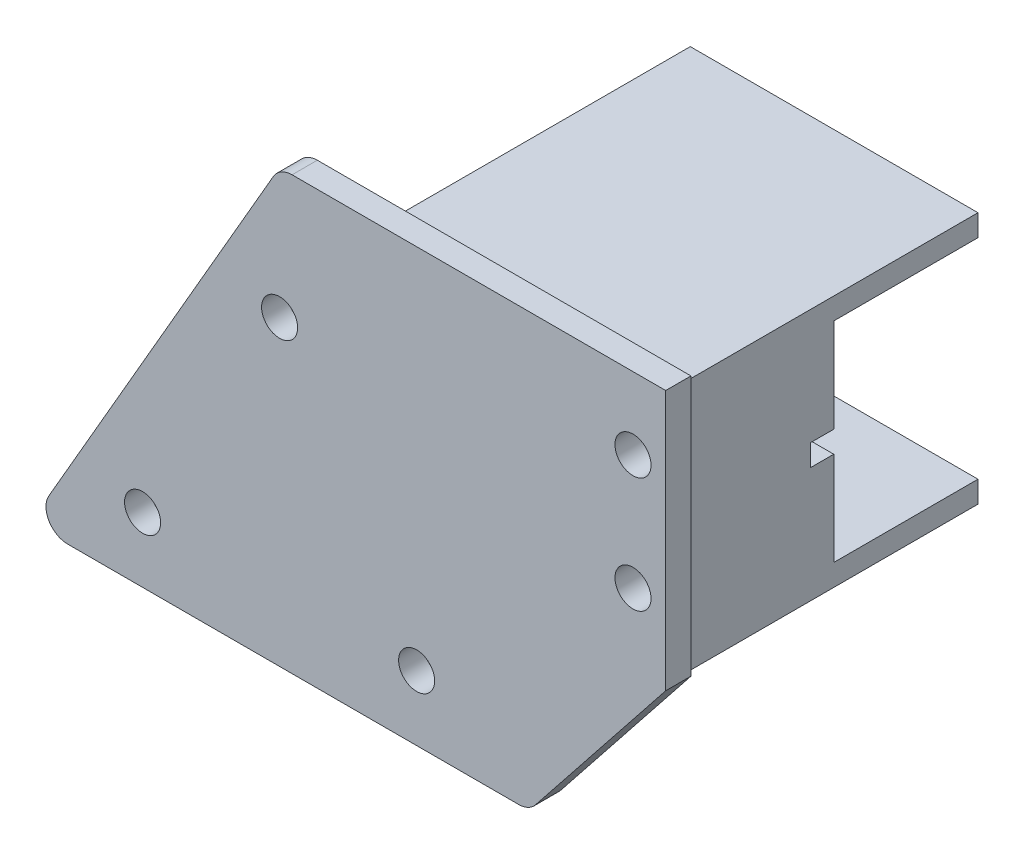
ISO-10303-21;
HEADER;
FILE_DESCRIPTION(('STEP AP214'),'2;1');
FILE_NAME('part.step','',(''),(''),'','','');
FILE_SCHEMA(('AUTOMOTIVE_DESIGN { 1 0 10303 214 1 1 1 1 }'));
ENDSEC;
DATA;
#1=APPLICATION_CONTEXT('core data for automotive mechanical design processes');
#2=APPLICATION_PROTOCOL_DEFINITION('international standard','automotive_design',2000,#1);
#3=PRODUCT_CONTEXT('',#1,'mechanical');
#4=PRODUCT('Part','Part','',(#3));
#5=PRODUCT_RELATED_PRODUCT_CATEGORY('part','',(#4));
#6=PRODUCT_DEFINITION_FORMATION('','',#4);
#7=PRODUCT_DEFINITION_CONTEXT('part definition',#1,'design');
#8=PRODUCT_DEFINITION('design','',#6,#7);
#9=PRODUCT_DEFINITION_SHAPE('','',#8);
#10=(LENGTH_UNIT() NAMED_UNIT(*) SI_UNIT(.MILLI.,.METRE.));
#11=(NAMED_UNIT(*) PLANE_ANGLE_UNIT() SI_UNIT($,.RADIAN.));
#12=(NAMED_UNIT(*) SI_UNIT($,.STERADIAN.) SOLID_ANGLE_UNIT());
#13=UNCERTAINTY_MEASURE_WITH_UNIT(LENGTH_MEASURE(1.E-05),#10,'distance_accuracy_value','');
#14=(GEOMETRIC_REPRESENTATION_CONTEXT(3) GLOBAL_UNCERTAINTY_ASSIGNED_CONTEXT((#13)) GLOBAL_UNIT_ASSIGNED_CONTEXT((#10,
#11,#12)) REPRESENTATION_CONTEXT('',''));
#15=CARTESIAN_POINT('',(0.,0.,0.));
#16=DIRECTION('',(0.,0.,1.));
#17=DIRECTION('',(1.,0.,0.));
#18=AXIS2_PLACEMENT_3D('',#15,#16,#17);
#19=CARTESIAN_POINT('',(0.,0.,-20.));
#20=DIRECTION('',(0.,0.,-1.));
#21=DIRECTION('',(-1.,0.,0.));
#22=AXIS2_PLACEMENT_3D('',#19,#20,#21);
#23=PLANE('',#22);
#24=CARTESIAN_POINT('',(50.8315186122816,40.9089653438087,-20.));
#25=DIRECTION('',(0.,0.,-1.));
#26=DIRECTION('',(-1.,0.,0.));
#27=AXIS2_PLACEMENT_3D('',#24,#25,#26);
#28=CIRCLE('',#27,2.5);
#29=CARTESIAN_POINT('',(48.3315186122816,40.9089653438087,-20.));
#30=VERTEX_POINT('',#29);
#31=EDGE_CURVE('E330',#30,#30,#28,.T.);
#32=ORIENTED_EDGE('',*,*,#31,.F.);
#33=EDGE_LOOP('',(#32));
#34=FACE_BOUND('',#33,.T.);
#35=DIRECTION('',(0.,-1.,0.));
#36=VECTOR('',#35,1.);
#37=CARTESIAN_POINT('',(46.8315186122816,0.,-20.));
#38=LINE('',#37,#36);
#39=CARTESIAN_POINT('',(46.8315186122816,47.4089653438087,-20.));
#40=VERTEX_POINT('',#39);
#41=CARTESIAN_POINT('',(46.8315186122816,34.4089653438087,-20.));
#42=VERTEX_POINT('',#41);
#43=EDGE_CURVE('E354',#40,#42,#38,.T.);
#44=ORIENTED_EDGE('',*,*,#43,.F.);
#45=DIRECTION('',(1.,0.,0.));
#46=VECTOR('',#45,1.);
#47=CARTESIAN_POINT('',(0.,47.4089653438087,-20.));
#48=LINE('',#47,#46);
#49=CARTESIAN_POINT('',(55.1718698455063,47.4089653438087,-20.));
#50=VERTEX_POINT('',#49);
#51=EDGE_CURVE('E306',#40,#50,#48,.T.);
#52=ORIENTED_EDGE('',*,*,#51,.T.);
#53=DIRECTION('',(0.,1.,0.));
#54=VECTOR('',#53,1.);
#55=CARTESIAN_POINT('',(55.1718698455063,47.4089653438087,-20.));
#56=LINE('',#55,#54);
#57=CARTESIAN_POINT('',(55.1718698455063,34.4089653438087,-20.));
#58=VERTEX_POINT('',#57);
#59=EDGE_CURVE('E335',#58,#50,#56,.T.);
#60=ORIENTED_EDGE('',*,*,#59,.F.);
#61=DIRECTION('',(1.,0.,0.));
#62=VECTOR('',#61,1.);
#63=CARTESIAN_POINT('',(0.,34.4089653438087,-20.));
#64=LINE('',#63,#62);
#65=EDGE_CURVE('E357',#42,#58,#64,.T.);
#66=ORIENTED_EDGE('',*,*,#65,.F.);
#67=EDGE_LOOP('',(#44,#52,#60,#66));
#68=FACE_BOUND('',#67,.T.);
#69=ADVANCED_FACE('F112',(#34,#68),#23,.T.);
#70=CARTESIAN_POINT('',(0.,0.,3.5));
#71=DIRECTION('',(0.,0.,-1.));
#72=DIRECTION('',(-1.,0.,0.));
#73=AXIS2_PLACEMENT_3D('',#70,#71,#72);
#74=PLANE('',#73);
#75=CARTESIAN_POINT('',(50.8315186122816,24.9089653438087,3.5));
#76=DIRECTION('',(0.,0.,-1.));
#77=DIRECTION('',(-1.,0.,0.));
#78=AXIS2_PLACEMENT_3D('',#75,#76,#77);
#79=CIRCLE('',#78,2.5);
#80=CARTESIAN_POINT('',(48.3315186122816,24.9089653438087,3.5));
#81=VERTEX_POINT('',#80);
#82=EDGE_CURVE('E309',#81,#81,#79,.T.);
#83=ORIENTED_EDGE('',*,*,#82,.T.);
#84=EDGE_LOOP('',(#83));
#85=FACE_BOUND('',#84,.T.);
#86=CARTESIAN_POINT('',(50.8315186122816,40.9089653438087,3.5));
#87=DIRECTION('',(0.,0.,-1.));
#88=DIRECTION('',(-1.,0.,0.));
#89=AXIS2_PLACEMENT_3D('',#86,#87,#88);
#90=CIRCLE('',#89,2.5);
#91=CARTESIAN_POINT('',(48.3315186122816,40.9089653438087,3.5));
#92=VERTEX_POINT('',#91);
#93=EDGE_CURVE('E312',#92,#92,#90,.T.);
#94=ORIENTED_EDGE('',*,*,#93,.T.);
#95=EDGE_LOOP('',(#94));
#96=FACE_BOUND('',#95,.T.);
#97=DIRECTION('',(-0.5,-0.866025403784439,0.));
#98=VECTOR('',#97,1.);
#99=CARTESIAN_POINT('',(1.83151861228162,50.9089653438087,3.5));
#100=LINE('',#99,#98);
#101=CARTESIAN_POINT('',(0.965493208497183,49.4089653438087,3.5));
#102=VERTEX_POINT('',#101);
#103=CARTESIAN_POINT('',(-30.158862444485,-4.50000000000001,3.5));
#104=VERTEX_POINT('',#103);
#105=EDGE_CURVE('E412',#102,#104,#100,.T.);
#106=ORIENTED_EDGE('',*,*,#105,.T.);
#107=CARTESIAN_POINT('',(-27.5607862331316,-6.00000000000001,3.5));
#108=DIRECTION('',(0.,0.,-1.));
#109=DIRECTION('',(-1.,0.,0.));
#110=AXIS2_PLACEMENT_3D('',#107,#108,#109);
#111=CIRCLE('',#110,3.);
#112=CARTESIAN_POINT('',(-27.5607862331316,-9.00000000000001,3.5));
#113=VERTEX_POINT('',#112);
#114=EDGE_CURVE('E453',#104,#113,#111,.F.);
#115=ORIENTED_EDGE('',*,*,#114,.T.);
#116=DIRECTION('',(1.,0.,0.));
#117=VECTOR('',#116,1.);
#118=CARTESIAN_POINT('',(-32.7569386558383,-9.00000000000001,3.5));
#119=LINE('',#118,#117);
#120=CARTESIAN_POINT('',(34.9718725917427,-9.,3.5));
#121=VERTEX_POINT('',#120);
#122=EDGE_CURVE('E415',#113,#121,#119,.T.);
#123=ORIENTED_EDGE('',*,*,#122,.T.);
#124=CARTESIAN_POINT('',(34.9718725917427,-6.,3.5));
#125=DIRECTION('',(0.,0.,-1.));
#126=DIRECTION('',(-1.,0.,0.));
#127=AXIS2_PLACEMENT_3D('',#124,#125,#126);
#128=CIRCLE('',#127,3.);
#129=CARTESIAN_POINT('',(37.3207823721256,-7.86617867408818,3.5));
#130=VERTEX_POINT('',#129);
#131=EDGE_CURVE('E455',#121,#130,#128,.F.);
#132=ORIENTED_EDGE('',*,*,#131,.T.);
#133=DIRECTION('',(0.622059558029392,0.782969926794304,0.));
#134=VECTOR('',#133,1.);
#135=CARTESIAN_POINT('',(36.4199758804015,-9.,3.5));
#136=LINE('',#135,#134);
#137=CARTESIAN_POINT('',(55.3674359778098,14.8486673083235,3.5));
#138=VERTEX_POINT('',#137);
#139=EDGE_CURVE('E418',#130,#138,#136,.T.);
#140=ORIENTED_EDGE('',*,*,#139,.T.);
#141=DIRECTION('',(0.,1.,0.));
#142=VECTOR('',#141,1.);
#143=CARTESIAN_POINT('',(55.3674359778098,14.8486673083235,3.5));
#144=LINE('',#143,#142);
#145=CARTESIAN_POINT('',(55.3674359778098,50.9089653438087,3.5));
#146=VERTEX_POINT('',#145);
#147=EDGE_CURVE('E420',#138,#146,#144,.T.);
#148=ORIENTED_EDGE('',*,*,#147,.T.);
#149=DIRECTION('',(-1.,0.,0.));
#150=VECTOR('',#149,1.);
#151=CARTESIAN_POINT('',(55.3674359778098,50.9089653438087,3.5));
#152=LINE('',#151,#150);
#153=CARTESIAN_POINT('',(3.5635694198505,50.9089653438087,3.5));
#154=VERTEX_POINT('',#153);
#155=EDGE_CURVE('E409',#146,#154,#152,.T.);
#156=ORIENTED_EDGE('',*,*,#155,.T.);
#157=CARTESIAN_POINT('',(3.5635694198505,47.9089653438087,3.5));
#158=DIRECTION('',(0.,0.,-1.));
#159=DIRECTION('',(-1.,0.,0.));
#160=AXIS2_PLACEMENT_3D('',#157,#158,#159);
#161=CIRCLE('',#160,3.);
#162=EDGE_CURVE('E457',#154,#102,#161,.F.);
#163=ORIENTED_EDGE('',*,*,#162,.T.);
#164=EDGE_LOOP('',(#106,#115,#123,#132,#140,#148,#156,#163));
#165=FACE_BOUND('',#164,.T.);
#166=CARTESIAN_POINT('',(1.83151861228162,32.9089653438087,3.5));
#167=DIRECTION('',(0.,0.,1.));
#168=DIRECTION('',(1.,0.,0.));
#169=AXIS2_PLACEMENT_3D('',#166,#167,#168);
#170=CIRCLE('',#169,2.5);
#171=CARTESIAN_POINT('',(4.33151861228162,32.9089653438087,3.5));
#172=VERTEX_POINT('',#171);
#173=EDGE_CURVE('E391',#172,#172,#170,.T.);
#174=ORIENTED_EDGE('',*,*,#173,.F.);
#175=EDGE_LOOP('',(#174));
#176=FACE_BOUND('',#175,.T.);
#177=CARTESIAN_POINT('',(20.8315186122816,0.,3.5));
#178=DIRECTION('',(0.,0.,1.));
#179=DIRECTION('',(1.,0.,0.));
#180=AXIS2_PLACEMENT_3D('',#177,#178,#179);
#181=CIRCLE('',#180,2.5);
#182=CARTESIAN_POINT('',(23.3315186122816,0.,3.5));
#183=VERTEX_POINT('',#182);
#184=EDGE_CURVE('E397',#183,#183,#181,.T.);
#185=ORIENTED_EDGE('',*,*,#184,.F.);
#186=EDGE_LOOP('',(#185));
#187=FACE_BOUND('',#186,.T.);
#188=CARTESIAN_POINT('',(-17.1684813877184,0.,3.5));
#189=DIRECTION('',(0.,0.,1.));
#190=DIRECTION('',(1.,0.,0.));
#191=AXIS2_PLACEMENT_3D('',#188,#189,#190);
#192=CIRCLE('',#191,2.5);
#193=CARTESIAN_POINT('',(-14.6684813877184,0.,3.5));
#194=VERTEX_POINT('',#193);
#195=EDGE_CURVE('E403',#194,#194,#192,.T.);
#196=ORIENTED_EDGE('',*,*,#195,.F.);
#197=EDGE_LOOP('',(#196));
#198=FACE_BOUND('',#197,.T.);
#199=ADVANCED_FACE('F473',(#85,#96,#165,#176,#187,#198),#74,.F.);
#200=CARTESIAN_POINT('',(0.,0.,0.));
#201=DIRECTION('',(0.,0.,-1.));
#202=DIRECTION('',(-1.,0.,0.));
#203=AXIS2_PLACEMENT_3D('',#200,#201,#202);
#204=PLANE('',#203);
#205=CARTESIAN_POINT('',(-27.5607862331316,-6.00000000000001,0.));
#206=DIRECTION('',(0.,0.,-1.));
#207=DIRECTION('',(-1.,0.,0.));
#208=AXIS2_PLACEMENT_3D('',#205,#206,#207);
#209=CIRCLE('',#208,3.);
#210=CARTESIAN_POINT('',(-27.5607862331316,-9.00000000000001,0.));
#211=VERTEX_POINT('',#210);
#212=CARTESIAN_POINT('',(-30.158862444485,-4.50000000000001,0.));
#213=VERTEX_POINT('',#212);
#214=EDGE_CURVE('E444',#211,#213,#209,.T.);
#215=ORIENTED_EDGE('',*,*,#214,.T.);
#216=DIRECTION('',(-0.5,-0.866025403784439,0.));
#217=VECTOR('',#216,1.);
#218=CARTESIAN_POINT('',(1.83151861228162,50.9089653438087,0.));
#219=LINE('',#218,#217);
#220=CARTESIAN_POINT('',(0.965493208497183,49.4089653438087,0.));
#221=VERTEX_POINT('',#220);
#222=EDGE_CURVE('E425',#221,#213,#219,.T.);
#223=ORIENTED_EDGE('',*,*,#222,.F.);
#224=CARTESIAN_POINT('',(3.5635694198505,47.9089653438087,0.));
#225=DIRECTION('',(0.,0.,-1.));
#226=DIRECTION('',(-1.,0.,0.));
#227=AXIS2_PLACEMENT_3D('',#224,#225,#226);
#228=CIRCLE('',#227,3.);
#229=CARTESIAN_POINT('',(3.5635694198505,50.9089653438087,0.));
#230=VERTEX_POINT('',#229);
#231=EDGE_CURVE('E449',#221,#230,#228,.T.);
#232=ORIENTED_EDGE('',*,*,#231,.T.);
#233=DIRECTION('',(-1.,0.,0.));
#234=VECTOR('',#233,1.);
#235=CARTESIAN_POINT('',(55.3674359778098,50.9089653438087,0.));
#236=LINE('',#235,#234);
#237=CARTESIAN_POINT('',(55.3674359778098,50.9089653438087,0.));
#238=VERTEX_POINT('',#237);
#239=EDGE_CURVE('E406',#238,#230,#236,.T.);
#240=ORIENTED_EDGE('',*,*,#239,.F.);
#241=DIRECTION('',(0.,1.,0.));
#242=VECTOR('',#241,1.);
#243=CARTESIAN_POINT('',(55.3674359778098,14.8486673083235,0.));
#244=LINE('',#243,#242);
#245=CARTESIAN_POINT('',(55.3674359778098,14.8486673083235,0.));
#246=VERTEX_POINT('',#245);
#247=EDGE_CURVE('E413',#246,#238,#244,.T.);
#248=ORIENTED_EDGE('',*,*,#247,.F.);
#249=DIRECTION('',(0.622059558029392,0.782969926794304,0.));
#250=VECTOR('',#249,1.);
#251=CARTESIAN_POINT('',(36.4199758804015,-9.,0.));
#252=LINE('',#251,#250);
#253=CARTESIAN_POINT('',(37.3207823721256,-7.86617867408818,0.));
#254=VERTEX_POINT('',#253);
#255=EDGE_CURVE('E430',#254,#246,#252,.T.);
#256=ORIENTED_EDGE('',*,*,#255,.F.);
#257=CARTESIAN_POINT('',(34.9718725917427,-6.,0.));
#258=DIRECTION('',(0.,0.,-1.));
#259=DIRECTION('',(-1.,0.,0.));
#260=AXIS2_PLACEMENT_3D('',#257,#258,#259);
#261=CIRCLE('',#260,3.);
#262=CARTESIAN_POINT('',(34.9718725917427,-9.,0.));
#263=VERTEX_POINT('',#262);
#264=EDGE_CURVE('E447',#254,#263,#261,.T.);
#265=ORIENTED_EDGE('',*,*,#264,.T.);
#266=DIRECTION('',(1.,0.,0.));
#267=VECTOR('',#266,1.);
#268=CARTESIAN_POINT('',(-32.7569386558383,-9.00000000000001,0.));
#269=LINE('',#268,#267);
#270=EDGE_CURVE('E427',#211,#263,#269,.T.);
#271=ORIENTED_EDGE('',*,*,#270,.F.);
#272=EDGE_LOOP('',(#215,#223,#232,#240,#248,#256,#265,#271));
#273=FACE_BOUND('',#272,.T.);
#274=DIRECTION('',(-1.,0.,0.));
#275=VECTOR('',#274,1.);
#276=CARTESIAN_POINT('',(55.1718698455063,47.4089653438087,0.));
#277=LINE('',#276,#275);
#278=CARTESIAN_POINT('',(46.8315186122816,47.4089653438087,0.));
#279=VERTEX_POINT('',#278);
#280=CARTESIAN_POINT('',(15.2761674177938,47.4089653438087,0.));
#281=VERTEX_POINT('',#280);
#282=EDGE_CURVE('E342',#279,#281,#277,.T.);
#283=ORIENTED_EDGE('',*,*,#282,.F.);
#284=DIRECTION('',(0.,-1.,0.));
#285=VECTOR('',#284,1.);
#286=CARTESIAN_POINT('',(46.8315186122816,0.,0.));
#287=LINE('',#286,#285);
#288=CARTESIAN_POINT('',(46.8315186122816,18.4089653438087,0.));
#289=VERTEX_POINT('',#288);
#290=EDGE_CURVE('E344',#279,#289,#287,.T.);
#291=ORIENTED_EDGE('',*,*,#290,.T.);
#292=DIRECTION('',(-1.,0.,0.));
#293=VECTOR('',#292,1.);
#294=CARTESIAN_POINT('',(0.,18.4089653438087,0.));
#295=LINE('',#294,#293);
#296=CARTESIAN_POINT('',(11.2524078934315,18.4089653438087,0.));
#297=VERTEX_POINT('',#296);
#298=EDGE_CURVE('E366',#289,#297,#295,.T.);
#299=ORIENTED_EDGE('',*,*,#298,.T.);
#300=DIRECTION('',(0.,-1.,0.));
#301=VECTOR('',#300,1.);
#302=CARTESIAN_POINT('',(11.2524078934315,0.,0.));
#303=LINE('',#302,#301);
#304=CARTESIAN_POINT('',(11.2524078934315,15.4089653438087,0.));
#305=VERTEX_POINT('',#304);
#306=EDGE_CURVE('E266',#297,#305,#303,.T.);
#307=ORIENTED_EDGE('',*,*,#306,.T.);
#308=DIRECTION('',(-1.,0.,0.));
#309=VECTOR('',#308,1.);
#310=CARTESIAN_POINT('',(0.,15.4089653438087,0.));
#311=LINE('',#310,#309);
#312=CARTESIAN_POINT('',(55.1718698455063,15.4089653438087,0.));
#313=VERTEX_POINT('',#312);
#314=EDGE_CURVE('E375',#313,#305,#311,.T.);
#315=ORIENTED_EDGE('',*,*,#314,.F.);
#316=DIRECTION('',(0.,-1.,0.));
#317=VECTOR('',#316,1.);
#318=CARTESIAN_POINT('',(55.1718698455063,0.,0.));
#319=LINE('',#318,#317);
#320=CARTESIAN_POINT('',(55.1718698455063,50.4089653438087,0.));
#321=VERTEX_POINT('',#320);
#322=EDGE_CURVE('E373',#321,#313,#319,.T.);
#323=ORIENTED_EDGE('',*,*,#322,.F.);
#324=DIRECTION('',(-1.,0.,0.));
#325=VECTOR('',#324,1.);
#326=CARTESIAN_POINT('',(55.1718698455063,50.4089653438087,0.));
#327=LINE('',#326,#325);
#328=CARTESIAN_POINT('',(15.2761674177938,50.4089653438087,0.));
#329=VERTEX_POINT('',#328);
#330=EDGE_CURVE('E336',#321,#329,#327,.T.);
#331=ORIENTED_EDGE('',*,*,#330,.T.);
#332=DIRECTION('',(0.,1.,0.));
#333=VECTOR('',#332,1.);
#334=CARTESIAN_POINT('',(15.2761674177938,47.4089653438087,0.));
#335=LINE('',#334,#333);
#336=EDGE_CURVE('E339',#281,#329,#335,.T.);
#337=ORIENTED_EDGE('',*,*,#336,.F.);
#338=EDGE_LOOP('',(#283,#291,#299,#307,#315,#323,#331,#337));
#339=FACE_BOUND('',#338,.T.);
#340=CARTESIAN_POINT('',(1.83151861228162,32.9089653438087,0.));
#341=DIRECTION('',(0.,0.,1.));
#342=DIRECTION('',(1.,0.,0.));
#343=AXIS2_PLACEMENT_3D('',#340,#341,#342);
#344=CIRCLE('',#343,2.5);
#345=CARTESIAN_POINT('',(4.33151861228162,32.9089653438087,0.));
#346=VERTEX_POINT('',#345);
#347=EDGE_CURVE('E390',#346,#346,#344,.T.);
#348=ORIENTED_EDGE('',*,*,#347,.T.);
#349=EDGE_LOOP('',(#348));
#350=FACE_BOUND('',#349,.T.);
#351=CARTESIAN_POINT('',(-17.1684813877184,0.,0.));
#352=DIRECTION('',(0.,0.,1.));
#353=DIRECTION('',(1.,0.,0.));
#354=AXIS2_PLACEMENT_3D('',#351,#352,#353);
#355=CIRCLE('',#354,2.5);
#356=CARTESIAN_POINT('',(-14.6684813877184,0.,0.));
#357=VERTEX_POINT('',#356);
#358=EDGE_CURVE('E400',#357,#357,#355,.T.);
#359=ORIENTED_EDGE('',*,*,#358,.T.);
#360=EDGE_LOOP('',(#359));
#361=FACE_BOUND('',#360,.T.);
#362=CARTESIAN_POINT('',(20.8315186122816,0.,0.));
#363=DIRECTION('',(0.,0.,1.));
#364=DIRECTION('',(1.,0.,0.));
#365=AXIS2_PLACEMENT_3D('',#362,#363,#364);
#366=CIRCLE('',#365,2.5);
#367=CARTESIAN_POINT('',(23.3315186122816,0.,0.));
#368=VERTEX_POINT('',#367);
#369=EDGE_CURVE('E394',#368,#368,#366,.T.);
#370=ORIENTED_EDGE('',*,*,#369,.T.);
#371=EDGE_LOOP('',(#370));
#372=FACE_BOUND('',#371,.T.);
#373=ADVANCED_FACE('F485',(#273,#339,#350,#361,#372),#204,.T.);
#374=CARTESIAN_POINT('',(55.3674359778098,50.9089653438087,3.5));
#375=DIRECTION('',(0.,-1.,0.));
#376=DIRECTION('',(0.,0.,-1.));
#377=AXIS2_PLACEMENT_3D('',#374,#375,#376);
#378=PLANE('',#377);
#379=ORIENTED_EDGE('',*,*,#239,.T.);
#380=DIRECTION('',(0.,0.,-1.));
#381=VECTOR('',#380,1.);
#382=CARTESIAN_POINT('',(3.5635694198505,50.9089653438087,3.5));
#383=LINE('',#382,#381);
#384=EDGE_CURVE('E451',#230,#154,#383,.F.);
#385=ORIENTED_EDGE('',*,*,#384,.T.);
#386=ORIENTED_EDGE('',*,*,#155,.F.);
#387=DIRECTION('',(0.,0.,-1.));
#388=VECTOR('',#387,1.);
#389=CARTESIAN_POINT('',(55.3674359778098,50.9089653438087,3.5));
#390=LINE('',#389,#388);
#391=EDGE_CURVE('E422',#146,#238,#390,.T.);
#392=ORIENTED_EDGE('',*,*,#391,.T.);
#393=EDGE_LOOP('',(#379,#385,#386,#392));
#394=FACE_BOUND('',#393,.T.);
#395=ADVANCED_FACE('F494',(#394),#378,.F.);
#396=CARTESIAN_POINT('',(1.83151861228162,50.9089653438087,3.5));
#397=DIRECTION('',(0.866025403784439,-0.5,0.));
#398=DIRECTION('',(0.5,0.866025403784439,0.));
#399=AXIS2_PLACEMENT_3D('',#396,#397,#398);
#400=PLANE('',#399);
#401=DIRECTION('',(0.,0.,-1.));
#402=VECTOR('',#401,1.);
#403=CARTESIAN_POINT('',(-30.158862444485,-4.50000000000001,3.5));
#404=LINE('',#403,#402);
#405=EDGE_CURVE('E438',#213,#104,#404,.F.);
#406=ORIENTED_EDGE('',*,*,#405,.T.);
#407=ORIENTED_EDGE('',*,*,#105,.F.);
#408=DIRECTION('',(0.,0.,-1.));
#409=VECTOR('',#408,1.);
#410=CARTESIAN_POINT('',(0.965493208497183,49.4089653438087,3.5));
#411=LINE('',#410,#409);
#412=EDGE_CURVE('E441',#102,#221,#411,.T.);
#413=ORIENTED_EDGE('',*,*,#412,.T.);
#414=ORIENTED_EDGE('',*,*,#222,.T.);
#415=EDGE_LOOP('',(#406,#407,#413,#414));
#416=FACE_BOUND('',#415,.T.);
#417=ADVANCED_FACE('F503',(#416),#400,.F.);
#418=CARTESIAN_POINT('',(-32.7569386558383,-9.00000000000001,3.5));
#419=DIRECTION('',(0.,1.,0.));
#420=DIRECTION('',(-1.,0.,0.));
#421=AXIS2_PLACEMENT_3D('',#418,#419,#420);
#422=PLANE('',#421);
#423=ORIENTED_EDGE('',*,*,#270,.T.);
#424=DIRECTION('',(0.,0.,-1.));
#425=VECTOR('',#424,1.);
#426=CARTESIAN_POINT('',(34.9718725917427,-9.,3.5));
#427=LINE('',#426,#425);
#428=EDGE_CURVE('E120',#263,#121,#427,.F.);
#429=ORIENTED_EDGE('',*,*,#428,.T.);
#430=ORIENTED_EDGE('',*,*,#122,.F.);
#431=DIRECTION('',(0.,0.,-1.));
#432=VECTOR('',#431,1.);
#433=CARTESIAN_POINT('',(-27.5607862331316,-9.00000000000001,3.5));
#434=LINE('',#433,#432);
#435=EDGE_CURVE('E462',#113,#211,#434,.T.);
#436=ORIENTED_EDGE('',*,*,#435,.T.);
#437=EDGE_LOOP('',(#423,#429,#430,#436));
#438=FACE_BOUND('',#437,.T.);
#439=ADVANCED_FACE('F467',(#438),#422,.F.);
#440=CARTESIAN_POINT('',(36.4199758804015,-9.,3.5));
#441=DIRECTION('',(-0.782969926794304,0.622059558029392,0.));
#442=DIRECTION('',(-0.622059558029392,-0.782969926794304,0.));
#443=AXIS2_PLACEMENT_3D('',#440,#441,#442);
#444=PLANE('',#443);
#445=ORIENTED_EDGE('',*,*,#139,.F.);
#446=DIRECTION('',(0.,0.,-1.));
#447=VECTOR('',#446,1.);
#448=CARTESIAN_POINT('',(37.3207823721256,-7.86617867408818,3.5));
#449=LINE('',#448,#447);
#450=EDGE_CURVE('E459',#130,#254,#449,.T.);
#451=ORIENTED_EDGE('',*,*,#450,.T.);
#452=ORIENTED_EDGE('',*,*,#255,.T.);
#453=DIRECTION('',(0.,0.,-1.));
#454=VECTOR('',#453,1.);
#455=CARTESIAN_POINT('',(55.3674359778098,14.8486673083235,3.5));
#456=LINE('',#455,#454);
#457=EDGE_CURVE('E435',#138,#246,#456,.T.);
#458=ORIENTED_EDGE('',*,*,#457,.F.);
#459=EDGE_LOOP('',(#445,#451,#452,#458));
#460=FACE_BOUND('',#459,.T.);
#461=ADVANCED_FACE('F481',(#460),#444,.F.);
#462=CARTESIAN_POINT('',(55.3674359778098,14.8486673083235,3.5));
#463=DIRECTION('',(-1.,0.,0.));
#464=DIRECTION('',(0.,0.,1.));
#465=AXIS2_PLACEMENT_3D('',#462,#463,#464);
#466=PLANE('',#465);
#467=ORIENTED_EDGE('',*,*,#247,.T.);
#468=ORIENTED_EDGE('',*,*,#391,.F.);
#469=ORIENTED_EDGE('',*,*,#147,.F.);
#470=ORIENTED_EDGE('',*,*,#457,.T.);
#471=EDGE_LOOP('',(#467,#468,#469,#470));
#472=FACE_BOUND('',#471,.T.);
#473=ADVANCED_FACE('F490',(#472),#466,.F.);
#474=CARTESIAN_POINT('',(-17.1684813877184,0.,3.5));
#475=DIRECTION('',(0.,0.,-1.));
#476=DIRECTION('',(-1.,0.,0.));
#477=AXIS2_PLACEMENT_3D('',#474,#475,#476);
#478=CYLINDRICAL_SURFACE('',#477,2.5);
#479=ORIENTED_EDGE('',*,*,#195,.T.);
#480=EDGE_LOOP('',(#479));
#481=FACE_BOUND('',#480,.T.);
#482=ORIENTED_EDGE('',*,*,#358,.F.);
#483=EDGE_LOOP('',(#482));
#484=FACE_BOUND('',#483,.T.);
#485=ADVANCED_FACE('F558',(#481,#484),#478,.F.);
#486=CARTESIAN_POINT('',(20.8315186122816,0.,3.5));
#487=DIRECTION('',(0.,0.,-1.));
#488=DIRECTION('',(-1.,0.,0.));
#489=AXIS2_PLACEMENT_3D('',#486,#487,#488);
#490=CYLINDRICAL_SURFACE('',#489,2.5);
#491=ORIENTED_EDGE('',*,*,#184,.T.);
#492=EDGE_LOOP('',(#491));
#493=FACE_BOUND('',#492,.T.);
#494=ORIENTED_EDGE('',*,*,#369,.F.);
#495=EDGE_LOOP('',(#494));
#496=FACE_BOUND('',#495,.T.);
#497=ADVANCED_FACE('F554',(#493,#496),#490,.F.);
#498=CARTESIAN_POINT('',(1.83151861228162,32.9089653438087,3.5));
#499=DIRECTION('',(0.,0.,-1.));
#500=DIRECTION('',(-1.,0.,0.));
#501=AXIS2_PLACEMENT_3D('',#498,#499,#500);
#502=CYLINDRICAL_SURFACE('',#501,2.5);
#503=ORIENTED_EDGE('',*,*,#173,.T.);
#504=EDGE_LOOP('',(#503));
#505=FACE_BOUND('',#504,.T.);
#506=ORIENTED_EDGE('',*,*,#347,.F.);
#507=EDGE_LOOP('',(#506));
#508=FACE_BOUND('',#507,.T.);
#509=ADVANCED_FACE('F551',(#505,#508),#502,.F.);
#510=CARTESIAN_POINT('',(3.5635694198505,47.9089653438087,3.5));
#511=DIRECTION('',(0.,0.,-1.));
#512=DIRECTION('',(-1.,0.,0.));
#513=AXIS2_PLACEMENT_3D('',#510,#511,#512);
#514=CYLINDRICAL_SURFACE('',#513,3.);
#515=ORIENTED_EDGE('',*,*,#162,.F.);
#516=ORIENTED_EDGE('',*,*,#384,.F.);
#517=ORIENTED_EDGE('',*,*,#231,.F.);
#518=ORIENTED_EDGE('',*,*,#412,.F.);
#519=EDGE_LOOP('',(#515,#516,#517,#518));
#520=FACE_BOUND('',#519,.T.);
#521=ADVANCED_FACE('F500',(#520),#514,.T.);
#522=CARTESIAN_POINT('',(34.9718725917427,-6.,3.5));
#523=DIRECTION('',(0.,0.,-1.));
#524=DIRECTION('',(-1.,0.,0.));
#525=AXIS2_PLACEMENT_3D('',#522,#523,#524);
#526=CYLINDRICAL_SURFACE('',#525,3.);
#527=ORIENTED_EDGE('',*,*,#131,.F.);
#528=ORIENTED_EDGE('',*,*,#428,.F.);
#529=ORIENTED_EDGE('',*,*,#264,.F.);
#530=ORIENTED_EDGE('',*,*,#450,.F.);
#531=EDGE_LOOP('',(#527,#528,#529,#530));
#532=FACE_BOUND('',#531,.T.);
#533=ADVANCED_FACE('F478',(#532),#526,.T.);
#534=CARTESIAN_POINT('',(-27.5607862331316,-6.00000000000001,3.5));
#535=DIRECTION('',(0.,0.,-1.));
#536=DIRECTION('',(-1.,0.,0.));
#537=AXIS2_PLACEMENT_3D('',#534,#535,#536);
#538=CYLINDRICAL_SURFACE('',#537,3.);
#539=ORIENTED_EDGE('',*,*,#114,.F.);
#540=ORIENTED_EDGE('',*,*,#405,.F.);
#541=ORIENTED_EDGE('',*,*,#214,.F.);
#542=ORIENTED_EDGE('',*,*,#435,.F.);
#543=EDGE_LOOP('',(#539,#540,#541,#542));
#544=FACE_BOUND('',#543,.T.);
#545=ADVANCED_FACE('F114',(#544),#538,.T.);
#546=CARTESIAN_POINT('',(46.8315186122816,0.,-20.));
#547=DIRECTION('',(-1.,0.,0.));
#548=DIRECTION('',(0.,0.,1.));
#549=AXIS2_PLACEMENT_3D('',#546,#547,#548);
#550=PLANE('',#549);
#551=ORIENTED_EDGE('',*,*,#290,.F.);
#552=DIRECTION('',(0.,0.,1.));
#553=VECTOR('',#552,1.);
#554=CARTESIAN_POINT('',(46.8315186122816,47.4089653438087,-20.));
#555=LINE('',#554,#553);
#556=EDGE_CURVE('E349',#40,#279,#555,.T.);
#557=ORIENTED_EDGE('',*,*,#556,.F.);
#558=ORIENTED_EDGE('',*,*,#43,.T.);
#559=DIRECTION('',(0.,0.,1.));
#560=VECTOR('',#559,1.);
#561=CARTESIAN_POINT('',(46.8315186122816,34.4089653438087,-20.));
#562=LINE('',#561,#560);
#563=CARTESIAN_POINT('',(46.8315186122816,34.4089653438087,-16.8));
#564=VERTEX_POINT('',#563);
#565=EDGE_CURVE('E325',#42,#564,#562,.T.);
#566=ORIENTED_EDGE('',*,*,#565,.T.);
#567=DIRECTION('',(0.,-1.,0.));
#568=VECTOR('',#567,1.);
#569=CARTESIAN_POINT('',(46.8315186122816,0.,-16.8));
#570=LINE('',#569,#568);
#571=CARTESIAN_POINT('',(46.8315186122816,31.4089653438087,-16.8));
#572=VERTEX_POINT('',#571);
#573=EDGE_CURVE('E320',#564,#572,#570,.T.);
#574=ORIENTED_EDGE('',*,*,#573,.T.);
#575=DIRECTION('',(0.,0.,1.));
#576=VECTOR('',#575,1.);
#577=CARTESIAN_POINT('',(46.8315186122816,31.4089653438087,-20.));
#578=LINE('',#577,#576);
#579=CARTESIAN_POINT('',(46.8315186122816,31.4089653438087,-20.));
#580=VERTEX_POINT('',#579);
#581=EDGE_CURVE('E134',#580,#572,#578,.T.);
#582=ORIENTED_EDGE('',*,*,#581,.F.);
#583=DIRECTION('',(0.,-1.,0.));
#584=VECTOR('',#583,1.);
#585=CARTESIAN_POINT('',(46.8315186122816,0.,-20.));
#586=LINE('',#585,#584);
#587=CARTESIAN_POINT('',(46.8315186122816,18.4089653438087,-20.));
#588=VERTEX_POINT('',#587);
#589=EDGE_CURVE('E365',#580,#588,#586,.T.);
#590=ORIENTED_EDGE('',*,*,#589,.T.);
#591=DIRECTION('',(0.,0.,1.));
#592=VECTOR('',#591,1.);
#593=CARTESIAN_POINT('',(46.8315186122816,18.4089653438087,-20.));
#594=LINE('',#593,#592);
#595=EDGE_CURVE('E271',#588,#289,#594,.T.);
#596=ORIENTED_EDGE('',*,*,#595,.T.);
#597=EDGE_LOOP('',(#551,#557,#558,#566,#574,#582,#590,#596));
#598=FACE_BOUND('',#597,.T.);
#599=ADVANCED_FACE('F507',(#598),#550,.T.);
#600=CARTESIAN_POINT('',(0.,31.4089653438087,-20.));
#601=DIRECTION('',(0.,-1.,0.));
#602=DIRECTION('',(0.,0.,-1.));
#603=AXIS2_PLACEMENT_3D('',#600,#601,#602);
#604=PLANE('',#603);
#605=ORIENTED_EDGE('',*,*,#581,.T.);
#606=DIRECTION('',(1.,0.,0.));
#607=VECTOR('',#606,1.);
#608=CARTESIAN_POINT('',(0.,31.4089653438087,-16.8));
#609=LINE('',#608,#607);
#610=CARTESIAN_POINT('',(55.1718698455063,31.4089653438087,-16.8));
#611=VERTEX_POINT('',#610);
#612=EDGE_CURVE('E315',#572,#611,#609,.T.);
#613=ORIENTED_EDGE('',*,*,#612,.T.);
#614=DIRECTION('',(0.,0.,1.));
#615=VECTOR('',#614,1.);
#616=CARTESIAN_POINT('',(55.1718698455063,31.4089653438087,-20.));
#617=LINE('',#616,#615);
#618=CARTESIAN_POINT('',(55.1718698455063,31.4089653438087,-20.));
#619=VERTEX_POINT('',#618);
#620=EDGE_CURVE('E386',#619,#611,#617,.T.);
#621=ORIENTED_EDGE('',*,*,#620,.F.);
#622=DIRECTION('',(1.,0.,0.));
#623=VECTOR('',#622,1.);
#624=CARTESIAN_POINT('',(0.,31.4089653438087,-20.));
#625=LINE('',#624,#623);
#626=EDGE_CURVE('E369',#580,#619,#625,.T.);
#627=ORIENTED_EDGE('',*,*,#626,.F.);
#628=EDGE_LOOP('',(#605,#613,#621,#627));
#629=FACE_BOUND('',#628,.T.);
#630=ADVANCED_FACE('F512',(#629),#604,.F.);
#631=CARTESIAN_POINT('',(55.1718698455063,0.,-20.));
#632=DIRECTION('',(-1.,0.,0.));
#633=DIRECTION('',(0.,0.,1.));
#634=AXIS2_PLACEMENT_3D('',#631,#632,#633);
#635=PLANE('',#634);
#636=ORIENTED_EDGE('',*,*,#322,.T.);
#637=DIRECTION('',(0.,0.,1.));
#638=VECTOR('',#637,1.);
#639=CARTESIAN_POINT('',(55.1718698455063,15.4089653438087,-20.));
#640=LINE('',#639,#638);
#641=CARTESIAN_POINT('',(55.1718698455063,15.4089653438087,-40.));
#642=VERTEX_POINT('',#641);
#643=EDGE_CURVE('E383',#642,#313,#640,.T.);
#644=ORIENTED_EDGE('',*,*,#643,.F.);
#645=DIRECTION('',(0.,-1.,0.));
#646=VECTOR('',#645,1.);
#647=CARTESIAN_POINT('',(55.1718698455063,0.,-40.));
#648=LINE('',#647,#646);
#649=CARTESIAN_POINT('',(55.1718698455063,18.4089653438087,-40.));
#650=VERTEX_POINT('',#649);
#651=EDGE_CURVE('E286',#650,#642,#648,.T.);
#652=ORIENTED_EDGE('',*,*,#651,.F.);
#653=DIRECTION('',(0.,0.,1.));
#654=VECTOR('',#653,1.);
#655=CARTESIAN_POINT('',(55.1718698455063,18.4089653438087,-40.));
#656=LINE('',#655,#654);
#657=CARTESIAN_POINT('',(55.1718698455063,18.4089653438087,-20.));
#658=VERTEX_POINT('',#657);
#659=EDGE_CURVE('E284',#650,#658,#656,.T.);
#660=ORIENTED_EDGE('',*,*,#659,.T.);
#661=DIRECTION('',(0.,-1.,0.));
#662=VECTOR('',#661,1.);
#663=CARTESIAN_POINT('',(55.1718698455063,0.,-20.));
#664=LINE('',#663,#662);
#665=EDGE_CURVE('E127',#619,#658,#664,.T.);
#666=ORIENTED_EDGE('',*,*,#665,.F.);
#667=ORIENTED_EDGE('',*,*,#620,.T.);
#668=DIRECTION('',(0.,-1.,0.));
#669=VECTOR('',#668,1.);
#670=CARTESIAN_POINT('',(55.1718698455063,0.,-16.8));
#671=LINE('',#670,#669);
#672=CARTESIAN_POINT('',(55.1718698455063,34.4089653438087,-16.8));
#673=VERTEX_POINT('',#672);
#674=EDGE_CURVE('E319',#673,#611,#671,.T.);
#675=ORIENTED_EDGE('',*,*,#674,.F.);
#676=DIRECTION('',(0.,0.,1.));
#677=VECTOR('',#676,1.);
#678=CARTESIAN_POINT('',(55.1718698455063,34.4089653438087,-20.));
#679=LINE('',#678,#677);
#680=EDGE_CURVE('E352',#58,#673,#679,.T.);
#681=ORIENTED_EDGE('',*,*,#680,.F.);
#682=ORIENTED_EDGE('',*,*,#59,.T.);
#683=DIRECTION('',(0.,0.,1.));
#684=VECTOR('',#683,1.);
#685=CARTESIAN_POINT('',(55.1718698455063,47.4089653438087,-40.));
#686=LINE('',#685,#684);
#687=CARTESIAN_POINT('',(55.1718698455063,47.4089653438087,-40.));
#688=VERTEX_POINT('',#687);
#689=EDGE_CURVE('E304',#688,#50,#686,.T.);
#690=ORIENTED_EDGE('',*,*,#689,.F.);
#691=DIRECTION('',(0.,1.,0.));
#692=VECTOR('',#691,1.);
#693=CARTESIAN_POINT('',(55.1718698455063,0.,-40.));
#694=LINE('',#693,#692);
#695=CARTESIAN_POINT('',(55.1718698455063,50.4089653438087,-40.));
#696=VERTEX_POINT('',#695);
#697=EDGE_CURVE('E301',#688,#696,#694,.T.);
#698=ORIENTED_EDGE('',*,*,#697,.T.);
#699=DIRECTION('',(0.,0.,1.));
#700=VECTOR('',#699,1.);
#701=CARTESIAN_POINT('',(55.1718698455063,50.4089653438087,-20.));
#702=LINE('',#701,#700);
#703=EDGE_CURVE('E332',#696,#321,#702,.T.);
#704=ORIENTED_EDGE('',*,*,#703,.T.);
#705=EDGE_LOOP('',(#636,#644,#652,#660,#666,#667,#675,#681,#682,#690,#698,#704));
#706=FACE_BOUND('',#705,.T.);
#707=ADVANCED_FACE('F541',(#706),#635,.F.);
#708=CARTESIAN_POINT('',(0.,15.4089653438087,-20.));
#709=DIRECTION('',(0.,1.,0.));
#710=DIRECTION('',(0.,0.,1.));
#711=AXIS2_PLACEMENT_3D('',#708,#709,#710);
#712=PLANE('',#711);
#713=ORIENTED_EDGE('',*,*,#314,.T.);
#714=DIRECTION('',(0.,0.,1.));
#715=VECTOR('',#714,1.);
#716=CARTESIAN_POINT('',(11.2524078934315,15.4089653438087,-20.));
#717=LINE('',#716,#715);
#718=CARTESIAN_POINT('',(11.2524078934315,15.4089653438087,-40.));
#719=VERTEX_POINT('',#718);
#720=EDGE_CURVE('E270',#719,#305,#717,.T.);
#721=ORIENTED_EDGE('',*,*,#720,.F.);
#722=DIRECTION('',(-1.,0.,0.));
#723=VECTOR('',#722,1.);
#724=CARTESIAN_POINT('',(0.,15.4089653438087,-40.));
#725=LINE('',#724,#723);
#726=EDGE_CURVE('E280',#642,#719,#725,.T.);
#727=ORIENTED_EDGE('',*,*,#726,.F.);
#728=ORIENTED_EDGE('',*,*,#643,.T.);
#729=EDGE_LOOP('',(#713,#721,#727,#728));
#730=FACE_BOUND('',#729,.T.);
#731=ADVANCED_FACE('F538',(#730),#712,.F.);
#732=CARTESIAN_POINT('',(11.2524078934315,0.,-20.));
#733=DIRECTION('',(-1.,0.,0.));
#734=DIRECTION('',(0.,0.,1.));
#735=AXIS2_PLACEMENT_3D('',#732,#733,#734);
#736=PLANE('',#735);
#737=ORIENTED_EDGE('',*,*,#306,.F.);
#738=DIRECTION('',(0.,0.,1.));
#739=VECTOR('',#738,1.);
#740=CARTESIAN_POINT('',(11.2524078934315,18.4089653438087,-20.));
#741=LINE('',#740,#739);
#742=CARTESIAN_POINT('',(11.2524078934315,18.4089653438087,-40.));
#743=VERTEX_POINT('',#742);
#744=EDGE_CURVE('E261',#743,#297,#741,.T.);
#745=ORIENTED_EDGE('',*,*,#744,.F.);
#746=DIRECTION('',(0.,-1.,0.));
#747=VECTOR('',#746,1.);
#748=CARTESIAN_POINT('',(11.2524078934315,0.,-40.));
#749=LINE('',#748,#747);
#750=EDGE_CURVE('E265',#743,#719,#749,.T.);
#751=ORIENTED_EDGE('',*,*,#750,.T.);
#752=ORIENTED_EDGE('',*,*,#720,.T.);
#753=EDGE_LOOP('',(#737,#745,#751,#752));
#754=FACE_BOUND('',#753,.T.);
#755=ADVANCED_FACE('F263',(#754),#736,.T.);
#756=CARTESIAN_POINT('',(50.8315186122816,24.9089653438087,-20.));
#757=DIRECTION('',(0.,0.,1.));
#758=DIRECTION('',(1.,0.,0.));
#759=AXIS2_PLACEMENT_3D('',#756,#757,#758);
#760=CYLINDRICAL_SURFACE('',#759,2.5);
#761=CARTESIAN_POINT('',(50.8315186122816,24.9089653438087,-20.));
#762=DIRECTION('',(0.,0.,-1.));
#763=DIRECTION('',(-1.,0.,0.));
#764=AXIS2_PLACEMENT_3D('',#761,#762,#763);
#765=CIRCLE('',#764,2.5);
#766=CARTESIAN_POINT('',(48.3315186122816,24.9089653438087,-20.));
#767=VERTEX_POINT('',#766);
#768=EDGE_CURVE('E362',#767,#767,#765,.T.);
#769=ORIENTED_EDGE('',*,*,#768,.T.);
#770=EDGE_LOOP('',(#769));
#771=FACE_BOUND('',#770,.T.);
#772=ORIENTED_EDGE('',*,*,#82,.F.);
#773=EDGE_LOOP('',(#772));
#774=FACE_BOUND('',#773,.T.);
#775=ADVANCED_FACE('F535',(#771,#774),#760,.F.);
#776=CARTESIAN_POINT('',(0.,18.4089653438087,-20.));
#777=DIRECTION('',(0.,1.,0.));
#778=DIRECTION('',(0.,0.,1.));
#779=AXIS2_PLACEMENT_3D('',#776,#777,#778);
#780=PLANE('',#779);
#781=ORIENTED_EDGE('',*,*,#298,.F.);
#782=ORIENTED_EDGE('',*,*,#595,.F.);
#783=DIRECTION('',(1.,0.,0.));
#784=VECTOR('',#783,1.);
#785=CARTESIAN_POINT('',(0.,18.4089653438087,-20.));
#786=LINE('',#785,#784);
#787=EDGE_CURVE('E13',#588,#658,#786,.T.);
#788=ORIENTED_EDGE('',*,*,#787,.T.);
#789=ORIENTED_EDGE('',*,*,#659,.F.);
#790=DIRECTION('',(-1.,0.,0.));
#791=VECTOR('',#790,1.);
#792=CARTESIAN_POINT('',(0.,18.4089653438087,-40.));
#793=LINE('',#792,#791);
#794=EDGE_CURVE('E278',#650,#743,#793,.T.);
#795=ORIENTED_EDGE('',*,*,#794,.T.);
#796=ORIENTED_EDGE('',*,*,#744,.T.);
#797=EDGE_LOOP('',(#781,#782,#788,#789,#795,#796));
#798=FACE_BOUND('',#797,.T.);
#799=ADVANCED_FACE('F282',(#798),#780,.T.);
#800=CARTESIAN_POINT('',(0.,0.,-20.));
#801=DIRECTION('',(0.,0.,-1.));
#802=DIRECTION('',(-1.,0.,0.));
#803=AXIS2_PLACEMENT_3D('',#800,#801,#802);
#804=PLANE('',#803);
#805=ORIENTED_EDGE('',*,*,#787,.F.);
#806=ORIENTED_EDGE('',*,*,#589,.F.);
#807=ORIENTED_EDGE('',*,*,#626,.T.);
#808=ORIENTED_EDGE('',*,*,#665,.T.);
#809=EDGE_LOOP('',(#805,#806,#807,#808));
#810=FACE_BOUND('',#809,.T.);
#811=ORIENTED_EDGE('',*,*,#768,.F.);
#812=EDGE_LOOP('',(#811));
#813=FACE_BOUND('',#812,.T.);
#814=ADVANCED_FACE('F529',(#810,#813),#804,.T.);
#815=CARTESIAN_POINT('',(0.,34.4089653438087,-20.));
#816=DIRECTION('',(0.,-1.,0.));
#817=DIRECTION('',(0.,0.,-1.));
#818=AXIS2_PLACEMENT_3D('',#815,#816,#817);
#819=PLANE('',#818);
#820=DIRECTION('',(1.,0.,0.));
#821=VECTOR('',#820,1.);
#822=CARTESIAN_POINT('',(0.,34.4089653438087,-16.8));
#823=LINE('',#822,#821);
#824=EDGE_CURVE('E316',#564,#673,#823,.T.);
#825=ORIENTED_EDGE('',*,*,#824,.F.);
#826=ORIENTED_EDGE('',*,*,#565,.F.);
#827=ORIENTED_EDGE('',*,*,#65,.T.);
#828=ORIENTED_EDGE('',*,*,#680,.T.);
#829=EDGE_LOOP('',(#825,#826,#827,#828));
#830=FACE_BOUND('',#829,.T.);
#831=ADVANCED_FACE('F527',(#830),#819,.T.);
#832=CARTESIAN_POINT('',(50.8315186122816,40.9089653438087,-20.));
#833=DIRECTION('',(0.,0.,1.));
#834=DIRECTION('',(1.,0.,0.));
#835=AXIS2_PLACEMENT_3D('',#832,#833,#834);
#836=CYLINDRICAL_SURFACE('',#835,2.5);
#837=ORIENTED_EDGE('',*,*,#31,.T.);
#838=EDGE_LOOP('',(#837));
#839=FACE_BOUND('',#838,.T.);
#840=ORIENTED_EDGE('',*,*,#93,.F.);
#841=EDGE_LOOP('',(#840));
#842=FACE_BOUND('',#841,.T.);
#843=ADVANCED_FACE('F607',(#839,#842),#836,.F.);
#844=CARTESIAN_POINT('',(55.1718698455063,50.4089653438087,-20.));
#845=DIRECTION('',(0.,1.,0.));
#846=DIRECTION('',(0.,0.,1.));
#847=AXIS2_PLACEMENT_3D('',#844,#845,#846);
#848=PLANE('',#847);
#849=ORIENTED_EDGE('',*,*,#330,.F.);
#850=ORIENTED_EDGE('',*,*,#703,.F.);
#851=DIRECTION('',(-1.,0.,0.));
#852=VECTOR('',#851,1.);
#853=CARTESIAN_POINT('',(0.,50.4089653438087,-40.));
#854=LINE('',#853,#852);
#855=CARTESIAN_POINT('',(15.2761674177938,50.4089653438087,-40.));
#856=VERTEX_POINT('',#855);
#857=EDGE_CURVE('E298',#696,#856,#854,.T.);
#858=ORIENTED_EDGE('',*,*,#857,.T.);
#859=DIRECTION('',(0.,0.,1.));
#860=VECTOR('',#859,1.);
#861=CARTESIAN_POINT('',(15.2761674177938,50.4089653438087,-20.));
#862=LINE('',#861,#860);
#863=EDGE_CURVE('E329',#856,#329,#862,.T.);
#864=ORIENTED_EDGE('',*,*,#863,.T.);
#865=EDGE_LOOP('',(#849,#850,#858,#864));
#866=FACE_BOUND('',#865,.T.);
#867=ADVANCED_FACE('F609',(#866),#848,.T.);
#868=CARTESIAN_POINT('',(15.2761674177938,47.4089653438087,-20.));
#869=DIRECTION('',(1.,0.,0.));
#870=DIRECTION('',(0.,0.,-1.));
#871=AXIS2_PLACEMENT_3D('',#868,#869,#870);
#872=PLANE('',#871);
#873=ORIENTED_EDGE('',*,*,#336,.T.);
#874=ORIENTED_EDGE('',*,*,#863,.F.);
#875=DIRECTION('',(0.,1.,0.));
#876=VECTOR('',#875,1.);
#877=CARTESIAN_POINT('',(15.2761674177938,0.,-40.));
#878=LINE('',#877,#876);
#879=CARTESIAN_POINT('',(15.2761674177938,47.4089653438087,-40.));
#880=VERTEX_POINT('',#879);
#881=EDGE_CURVE('E295',#880,#856,#878,.T.);
#882=ORIENTED_EDGE('',*,*,#881,.F.);
#883=DIRECTION('',(0.,0.,1.));
#884=VECTOR('',#883,1.);
#885=CARTESIAN_POINT('',(15.2761674177938,47.4089653438087,-20.));
#886=LINE('',#885,#884);
#887=EDGE_CURVE('E326',#880,#281,#886,.T.);
#888=ORIENTED_EDGE('',*,*,#887,.T.);
#889=EDGE_LOOP('',(#873,#874,#882,#888));
#890=FACE_BOUND('',#889,.T.);
#891=ADVANCED_FACE('F717',(#890),#872,.F.);
#892=CARTESIAN_POINT('',(55.1718698455063,47.4089653438087,-20.));
#893=DIRECTION('',(0.,1.,0.));
#894=DIRECTION('',(0.,0.,1.));
#895=AXIS2_PLACEMENT_3D('',#892,#893,#894);
#896=PLANE('',#895);
#897=ORIENTED_EDGE('',*,*,#887,.F.);
#898=DIRECTION('',(-1.,0.,0.));
#899=VECTOR('',#898,1.);
#900=CARTESIAN_POINT('',(0.,47.4089653438087,-40.));
#901=LINE('',#900,#899);
#902=EDGE_CURVE('E292',#688,#880,#901,.T.);
#903=ORIENTED_EDGE('',*,*,#902,.F.);
#904=ORIENTED_EDGE('',*,*,#689,.T.);
#905=ORIENTED_EDGE('',*,*,#51,.F.);
#906=ORIENTED_EDGE('',*,*,#556,.T.);
#907=ORIENTED_EDGE('',*,*,#282,.T.);
#908=EDGE_LOOP('',(#897,#903,#904,#905,#906,#907));
#909=FACE_BOUND('',#908,.T.);
#910=ADVANCED_FACE('F532',(#909),#896,.F.);
#911=CARTESIAN_POINT('',(0.,0.,-16.8));
#912=DIRECTION('',(0.,0.,-1.));
#913=DIRECTION('',(-1.,0.,0.));
#914=AXIS2_PLACEMENT_3D('',#911,#912,#913);
#915=PLANE('',#914);
#916=ORIENTED_EDGE('',*,*,#612,.F.);
#917=ORIENTED_EDGE('',*,*,#573,.F.);
#918=ORIENTED_EDGE('',*,*,#824,.T.);
#919=ORIENTED_EDGE('',*,*,#674,.T.);
#920=EDGE_LOOP('',(#916,#917,#918,#919));
#921=FACE_BOUND('',#920,.T.);
#922=ADVANCED_FACE('F616',(#921),#915,.T.);
#923=CARTESIAN_POINT('',(0.,0.,-40.));
#924=DIRECTION('',(0.,0.,-1.));
#925=DIRECTION('',(-1.,0.,0.));
#926=AXIS2_PLACEMENT_3D('',#923,#924,#925);
#927=PLANE('',#926);
#928=ORIENTED_EDGE('',*,*,#902,.T.);
#929=ORIENTED_EDGE('',*,*,#881,.T.);
#930=ORIENTED_EDGE('',*,*,#857,.F.);
#931=ORIENTED_EDGE('',*,*,#697,.F.);
#932=EDGE_LOOP('',(#928,#929,#930,#931));
#933=FACE_BOUND('',#932,.T.);
#934=ADVANCED_FACE('F621',(#933),#927,.T.);
#935=CARTESIAN_POINT('',(0.,0.,-40.));
#936=DIRECTION('',(0.,0.,-1.));
#937=DIRECTION('',(-1.,0.,0.));
#938=AXIS2_PLACEMENT_3D('',#935,#936,#937);
#939=PLANE('',#938);
#940=ORIENTED_EDGE('',*,*,#750,.F.);
#941=ORIENTED_EDGE('',*,*,#794,.F.);
#942=ORIENTED_EDGE('',*,*,#651,.T.);
#943=ORIENTED_EDGE('',*,*,#726,.T.);
#944=EDGE_LOOP('',(#940,#941,#942,#943));
#945=FACE_BOUND('',#944,.T.);
#946=ADVANCED_FACE('F276',(#945),#939,.T.);
#947=CLOSED_SHELL('',(#69,#199,#373,#395,#417,#439,#461,#473,#485,#497,#509,#521,#533,#545,#599,
#630,#707,#731,#755,#775,#799,#814,#831,#843,#867,#891,#910,#922,#934,#946));
#948=MANIFOLD_SOLID_BREP('B2',#947);
#949=ADVANCED_BREP_SHAPE_REPRESENTATION('',(#18,#948),#14);
#950=SHAPE_DEFINITION_REPRESENTATION(#9,#949);
ENDSEC;
END-ISO-10303-21;
